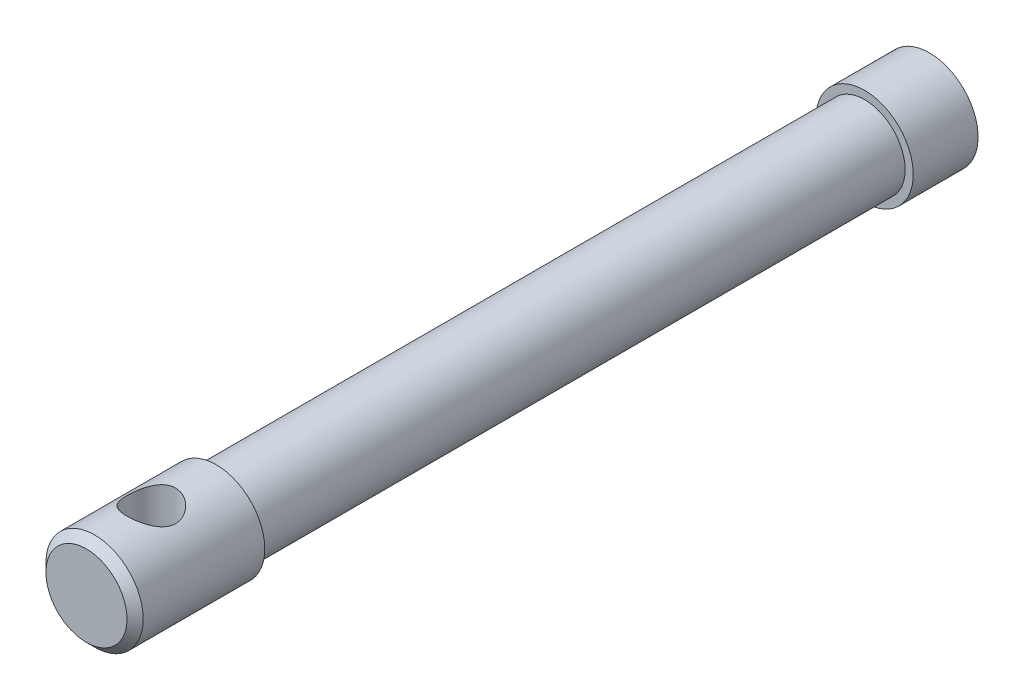
ISO-10303-21;
HEADER;
FILE_DESCRIPTION(('STEP AP214'),'2;1');
FILE_NAME('part.step','',(''),(''),'','','');
FILE_SCHEMA(('AUTOMOTIVE_DESIGN { 1 0 10303 214 1 1 1 1 }'));
ENDSEC;
DATA;
#1=APPLICATION_CONTEXT('core data for automotive mechanical design processes');
#2=APPLICATION_PROTOCOL_DEFINITION('international standard','automotive_design',2000,#1);
#3=PRODUCT_CONTEXT('',#1,'mechanical');
#4=PRODUCT('Part','Part','',(#3));
#5=PRODUCT_RELATED_PRODUCT_CATEGORY('part','',(#4));
#6=PRODUCT_DEFINITION_FORMATION('','',#4);
#7=PRODUCT_DEFINITION_CONTEXT('part definition',#1,'design');
#8=PRODUCT_DEFINITION('design','',#6,#7);
#9=PRODUCT_DEFINITION_SHAPE('','',#8);
#10=(LENGTH_UNIT() NAMED_UNIT(*) SI_UNIT(.MILLI.,.METRE.));
#11=(NAMED_UNIT(*) PLANE_ANGLE_UNIT() SI_UNIT($,.RADIAN.));
#12=(NAMED_UNIT(*) SI_UNIT($,.STERADIAN.) SOLID_ANGLE_UNIT());
#13=UNCERTAINTY_MEASURE_WITH_UNIT(LENGTH_MEASURE(1.E-05),#10,'distance_accuracy_value','');
#14=(GEOMETRIC_REPRESENTATION_CONTEXT(3) GLOBAL_UNCERTAINTY_ASSIGNED_CONTEXT((#13)) GLOBAL_UNIT_ASSIGNED_CONTEXT((#10,
#11,#12)) REPRESENTATION_CONTEXT('',''));
#15=CARTESIAN_POINT('',(0.,0.,0.));
#16=DIRECTION('',(0.,0.,1.));
#17=DIRECTION('',(1.,0.,0.));
#18=AXIS2_PLACEMENT_3D('',#15,#16,#17);
#19=CARTESIAN_POINT('',(0.,0.,-165.1));
#20=DIRECTION('',(0.,0.,1.));
#21=DIRECTION('',(1.,0.,0.));
#22=AXIS2_PLACEMENT_3D('',#19,#20,#21);
#23=CYLINDRICAL_SURFACE('',#22,7.9375);
#24=CARTESIAN_POINT('',(0.,0.,-25.4));
#25=DIRECTION('',(0.,0.,1.));
#26=DIRECTION('',(1.,0.,0.));
#27=AXIS2_PLACEMENT_3D('',#24,#25,#26);
#28=CIRCLE('',#27,7.9375);
#29=CARTESIAN_POINT('',(7.9375,0.,-25.4));
#30=VERTEX_POINT('',#29);
#31=EDGE_CURVE('E52',#30,#30,#28,.F.);
#32=ORIENTED_EDGE('',*,*,#31,.T.);
#33=EDGE_LOOP('',(#32));
#34=FACE_BOUND('',#33,.T.);
#35=CARTESIAN_POINT('',(0.,0.,-152.4));
#36=DIRECTION('',(0.,0.,-1.));
#37=DIRECTION('',(-1.,0.,0.));
#38=AXIS2_PLACEMENT_3D('',#35,#36,#37);
#39=CIRCLE('',#38,7.9375);
#40=CARTESIAN_POINT('',(-7.9375,0.,-152.4));
#41=VERTEX_POINT('',#40);
#42=EDGE_CURVE('E41',#41,#41,#39,.F.);
#43=ORIENTED_EDGE('',*,*,#42,.T.);
#44=EDGE_LOOP('',(#43));
#45=FACE_BOUND('',#44,.T.);
#46=ADVANCED_FACE('F37',(#34,#45),#23,.T.);
#47=CARTESIAN_POINT('',(0.,0.,-25.4));
#48=DIRECTION('',(0.,0.,1.));
#49=DIRECTION('',(1.,0.,0.));
#50=AXIS2_PLACEMENT_3D('',#47,#48,#49);
#51=CYLINDRICAL_SURFACE('',#50,9.525);
#52=CARTESIAN_POINT('',(0.,-9.525,-17.4625));
#53=CARTESIAN_POINT('',(-0.125243167799989,-9.5249996206372,-17.4624995883142));
#54=CARTESIAN_POINT('',(-0.250495089131835,-9.52252400598023,-17.4575538815409));
#55=CARTESIAN_POINT('',(-0.500076393496526,-9.51268396387997,-17.4378274933583));
#56=CARTESIAN_POINT('',(-0.624405351393146,-9.50531740964971,-17.4230425334198));
#57=CARTESIAN_POINT('',(-0.871331001268148,-9.48587193787975,-17.3837846575478));
#58=CARTESIAN_POINT('',(-0.993924963523298,-9.47378630044847,-17.359297925728));
#59=CARTESIAN_POINT('',(-1.23637011508467,-9.44520637539277,-17.3009077343834));
#60=CARTESIAN_POINT('',(-1.35622016139572,-9.42871028557932,-17.2670004252214));
#61=CARTESIAN_POINT('',(-1.59183120722171,-9.39179697222459,-17.1902959954649));
#62=CARTESIAN_POINT('',(-1.70760770137533,-9.37139708461428,-17.1475381122571));
#63=CARTESIAN_POINT('',(-1.93495086483045,-9.3271126718355,-17.0534500200897));
#64=CARTESIAN_POINT('',(-2.04651593025,-9.30322683559748,-17.0021165847989));
#65=CARTESIAN_POINT('',(-2.37384489745524,-9.22716144615755,-16.8359458534294));
#66=CARTESIAN_POINT('',(-2.58250225923313,-9.17053150857179,-16.7088526884547));
#67=CARTESIAN_POINT('',(-2.9885453858336,-9.04666081910159,-16.4170309696508));
#68=CARTESIAN_POINT('',(-3.18448556312959,-8.97898540114139,-16.2504907176509));
#69=CARTESIAN_POINT('',(-3.5469969745544,-8.84205954293001,-15.8884088932679));
#70=CARTESIAN_POINT('',(-3.71354582861883,-8.77280794740667,-15.6928454279268));
#71=CARTESIAN_POINT('',(-4.02553537328567,-8.63435408613187,-15.2598674226152));
#72=CARTESIAN_POINT('',(-4.16833749963762,-8.56557212539103,-15.0203834507436));
#73=CARTESIAN_POINT('',(-4.35029005345508,-8.47379640254792,-14.6431780616274));
#74=CARTESIAN_POINT('',(-4.40557901885787,-8.44509626519091,-14.514399825047));
#75=CARTESIAN_POINT('',(-4.50483773649694,-8.39256904955604,-14.2516213108777));
#76=CARTESIAN_POINT('',(-4.54881419057647,-8.36873908777994,-14.1176241795386));
#77=CARTESIAN_POINT('',(-4.62261399582858,-8.32818911059645,-13.8534843907029));
#78=CARTESIAN_POINT('',(-4.65312214328153,-8.31113119648639,-13.7235845780924));
#79=CARTESIAN_POINT('',(-4.7031837839128,-8.28290506375683,-13.4611183128582));
#80=CARTESIAN_POINT('',(-4.72274308921002,-8.27173372047612,-13.3285533138226));
#81=CARTESIAN_POINT('',(-4.75061653464239,-8.25575723957705,-13.0619427455447));
#82=CARTESIAN_POINT('',(-4.75893744712047,-8.25094826797976,-12.9278981170864));
#83=CARTESIAN_POINT('',(-4.76421854927812,-8.24790017307781,-12.659518180681));
#84=CARTESIAN_POINT('',(-4.76117982286953,-8.24966042295241,-12.5251829016895));
#85=CARTESIAN_POINT('',(-4.74483797280581,-8.25906842780931,-12.2735605369466));
#86=CARTESIAN_POINT('',(-4.73280973448218,-8.26598467895691,-12.1561612672688));
#87=CARTESIAN_POINT('',(-4.7001560114978,-8.28459407928507,-11.9229366742551));
#88=CARTESIAN_POINT('',(-4.67952782662532,-8.29628872876442,-11.8071118570707));
#89=CARTESIAN_POINT('',(-4.60506661909892,-8.33800444414718,-11.4632035948973));
#90=CARTESIAN_POINT('',(-4.5386452957775,-8.37466460391199,-11.2385132214148));
#91=CARTESIAN_POINT('',(-4.37297035741612,-8.46236620531704,-10.7986357725427));
#92=CARTESIAN_POINT('',(-4.27298801966147,-8.51372273880604,-10.5837919649744));
#93=CARTESIAN_POINT('',(-4.04355977442936,-8.62505005190895,-10.1728624960871));
#94=CARTESIAN_POINT('',(-3.91410063264099,-8.68502469635285,-9.97678531682722));
#95=CARTESIAN_POINT('',(-3.61029947812719,-8.8160120789406,-9.58284506896536));
#96=CARTESIAN_POINT('',(-3.43234782914613,-8.88746017331488,-9.38790797985575));
#97=CARTESIAN_POINT('',(-3.04584295330871,-9.02721381532401,-9.02935121852992));
#98=CARTESIAN_POINT('',(-2.83727518509305,-9.0955178493011,-8.86574651343943));
#99=CARTESIAN_POINT('',(-2.49965137796343,-9.19195370403877,-8.64383467336283));
#100=CARTESIAN_POINT('',(-2.38002127368373,-9.22372787983903,-8.57248202968255));
#101=CARTESIAN_POINT('',(-2.13427687141611,-9.28366556941997,-8.44022178631796));
#102=CARTESIAN_POINT('',(-2.00816533613017,-9.31183060399966,-8.37930978353973));
#103=CARTESIAN_POINT('',(-1.75034069526615,-9.36371844925579,-8.26859004451779));
#104=CARTESIAN_POINT('',(-1.61862987016266,-9.38744304755806,-8.21877783818485));
#105=CARTESIAN_POINT('',(-1.3505610663951,-9.42974072645533,-8.13083376217831));
#106=CARTESIAN_POINT('',(-1.21420362433566,-9.4483143996453,-8.09270054882684));
#107=CARTESIAN_POINT('',(-0.949450109300049,-9.47841891468132,-8.03128927908233));
#108=CARTESIAN_POINT('',(-0.821329961906903,-9.49040564136936,-8.00704248612877));
#109=CARTESIAN_POINT('',(-0.563164063018348,-9.50921741531494,-7.96911534118488));
#110=CARTESIAN_POINT('',(-0.43311848278076,-9.51604291885924,-7.95543405513057));
#111=CARTESIAN_POINT('',(-0.172222200636558,-9.52433687415141,-7.93882096304197));
#112=CARTESIAN_POINT('',(-0.0413718261918276,-9.52580737679104,-7.93588504167853));
#113=CARTESIAN_POINT('',(0.220072847166309,-9.52335444060485,-7.94079143418983));
#114=CARTESIAN_POINT('',(0.350667157156419,-9.51943124049279,-7.94863327106403));
#115=CARTESIAN_POINT('',(0.600383632816324,-9.50681651861088,-7.97396043682593));
#116=CARTESIAN_POINT('',(0.719607798059651,-9.49851975936574,-7.99064795465564));
#117=CARTESIAN_POINT('',(0.956123558476325,-9.47763434053446,-8.03291618607806));
#118=CARTESIAN_POINT('',(1.07341452918894,-9.46504432155854,-8.05849971649687));
#119=CARTESIAN_POINT('',(1.30523272581463,-9.43586934009923,-8.11828705590225));
#120=CARTESIAN_POINT('',(1.41976078572846,-9.41928560017321,-8.15248822700577));
#121=CARTESIAN_POINT('',(1.64542419391326,-9.382499981618,-8.22918232366048));
#122=CARTESIAN_POINT('',(1.75655822362735,-9.36229671724176,-8.27167842551346));
#123=CARTESIAN_POINT('',(2.09007412634844,-9.29566539786795,-8.4137002860248));
#124=CARTESIAN_POINT('',(2.3061103310862,-9.24405921515466,-8.52608855655025));
#125=CARTESIAN_POINT('',(2.7168591855057,-9.13180205397676,-8.78098846404179));
#126=CARTESIAN_POINT('',(2.91156269769227,-9.07114722574502,-8.92351293334768));
#127=CARTESIAN_POINT('',(3.29452731372962,-8.93960783885979,-9.25079489471238));
#128=CARTESIAN_POINT('',(3.48027815582498,-8.868303631423,-9.43832528614419));
#129=CARTESIAN_POINT('',(3.81886460963264,-8.72786114875584,-9.84218618662009));
#130=CARTESIAN_POINT('',(3.97167745144758,-8.65872439991558,-10.0585364526084));
#131=CARTESIAN_POINT('',(4.17638881115548,-8.56092960704944,-10.4068472643334));
#132=CARTESIAN_POINT('',(4.24173741059432,-8.52864647367417,-10.5300629580027));
#133=CARTESIAN_POINT('',(4.36167001930206,-8.46793790675362,-10.782516630992));
#134=CARTESIAN_POINT('',(4.41625890421415,-8.43951072775552,-10.9117518496581));
#135=CARTESIAN_POINT('',(4.51403084118841,-8.38762286815761,-11.1753113761473));
#136=CARTESIAN_POINT('',(4.55722321448887,-8.36415813189979,-11.3096314216019));
#137=CARTESIAN_POINT('',(4.63167416627274,-8.32316235190995,-11.5824232182906));
#138=CARTESIAN_POINT('',(4.66293459251873,-8.30563038948562,-11.7208943231132));
#139=CARTESIAN_POINT('',(4.71062527640278,-8.27866590076996,-11.9873061449123));
#140=CARTESIAN_POINT('',(4.72819092555356,-8.26861751501085,-12.1149820086718));
#141=CARTESIAN_POINT('',(4.75291664228841,-8.25443000373948,-12.3716591965268));
#142=CARTESIAN_POINT('',(4.76007780009145,-8.25029025909993,-12.5006603803239));
#143=CARTESIAN_POINT('',(4.7638856717754,-8.24809207938036,-12.7588234710669));
#144=CARTESIAN_POINT('',(4.76053608147038,-8.25003150672727,-12.8879853055593));
#145=CARTESIAN_POINT('',(4.74338307929259,-8.2599055190099,-13.1453752439453));
#146=CARTESIAN_POINT('',(4.72958009537705,-8.26783985851659,-13.2736033858471));
#147=CARTESIAN_POINT('',(4.69353669139923,-8.28834856879423,-13.5158735925565));
#148=CARTESIAN_POINT('',(4.67222934629288,-8.30040666790683,-13.6300996380418));
#149=CARTESIAN_POINT('',(4.62147643847892,-8.32877048505192,-13.8562027840155));
#150=CARTESIAN_POINT('',(4.59202835912458,-8.34507751652014,-13.9680791465907));
#151=CARTESIAN_POINT('',(4.49189766535446,-8.3996615585496,-14.299168552145));
#152=CARTESIAN_POINT('',(4.40940547807408,-8.44361545117001,-14.5139944304742));
#153=CARTESIAN_POINT('',(4.20916574352957,-8.54528603634261,-14.9413852260527));
#154=CARTESIAN_POINT('',(4.08942191082135,-8.60372898549138,-15.1528285423799));
#155=CARTESIAN_POINT('',(3.82024338512734,-8.72658246261697,-15.5540368143899));
#156=CARTESIAN_POINT('',(3.67079324521365,-8.79099608593484,-15.7437904104806));
#157=CARTESIAN_POINT('',(3.32520368388597,-8.92789150982252,-16.1201492351934));
#158=CARTESIAN_POINT('',(3.12559766366325,-9.00040265167881,-16.3035704078762));
#159=CARTESIAN_POINT('',(2.69626914168462,-9.13818513010387,-16.6350960361771));
#160=CARTESIAN_POINT('',(2.4665305095516,-9.20345255422175,-16.7831814555507));
#161=CARTESIAN_POINT('',(2.10268072495819,-9.29086610240478,-16.9754204698368));
#162=CARTESIAN_POINT('',(1.97763300723183,-9.31834760006229,-17.0347008931346));
#163=CARTESIAN_POINT('',(1.72211552262134,-9.36893044835914,-17.1423991887047));
#164=CARTESIAN_POINT('',(1.59164845695407,-9.39203394996841,-17.1908223974304));
#165=CARTESIAN_POINT('',(1.32654199767925,-9.43312646132604,-17.2761390300447));
#166=CARTESIAN_POINT('',(1.19191242135595,-9.45112661821364,-17.3130576010708));
#167=CARTESIAN_POINT('',(0.919388438520269,-9.48151473751691,-17.3750010604458));
#168=CARTESIAN_POINT('',(0.781496080561077,-9.49390612793916,-17.400033214082));
#169=CARTESIAN_POINT('',(0.536297175823774,-9.51048759454479,-17.4334244917289));
#170=CARTESIAN_POINT('',(0.42941158376785,-9.51592021375587,-17.4443184453916));
#171=CARTESIAN_POINT('',(0.215019489362878,-9.52317662911679,-17.4588564762833));
#172=CARTESIAN_POINT('',(0.107512969957934,-9.52500032565785,-17.462500353405));
#173=CARTESIAN_POINT('',(0.,-9.525,-17.4625));
#174=B_SPLINE_CURVE_WITH_KNOTS('',3,(#52,#53,#54,#55,#56,#57,#58,#59,#60,#61,#62,#63,#64,#65,
#66,#67,#68,#69,#70,#71,#72,#73,#74,#75,#76,#77,#78,#79,#80,#81,#82,#83,#84,#85,#86,#87,#88,#89,
#90,#91,#92,#93,#94,#95,#96,#97,#98,#99,#100,#101,#102,#103,#104,#105,#106,#107,#108,#109,#110,
#111,#112,#113,#114,#115,#116,#117,#118,#119,#120,#121,#122,#123,#124,#125,#126,#127,#128,#129,
#130,#131,#132,#133,#134,#135,#136,#137,#138,#139,#140,#141,#142,#143,#144,#145,#146,#147,#148,
#149,#150,#151,#152,#153,#154,#155,#156,#157,#158,#159,#160,#161,#162,#163,#164,#165,#166,#167,
#168,#169,#170,#171,#172,#173),.UNSPECIFIED.,.T.,.F.,(4,2,2,2,2,2,2,2,2,2,2,2,2,2,2,2,2,2,2,2,2,
2,2,2,2,2,2,2,2,2,2,2,2,2,2,2,2,2,2,2,2,2,2,2,2,2,2,2,2,2,2,2,2,2,2,2,2,2,2,2,4),(0.,
0.37562341815402,0.751410280296022,1.12773421934005,1.50421216665562,1.87905550525341,
2.25404018794787,3.00318908218551,3.7976597983107,4.59273287924314,5.44946389368039,
5.8781190538996,6.30651967909288,6.70950847539314,7.11228314445236,7.51481498990845,
7.91730842763879,8.27152461989833,8.62585211283934,9.33399259637595,10.0586277474397,
10.7835888844336,11.6004728904415,12.4177461446779,12.8458801890468,13.2738332313566,
13.701613616489,14.1293447666274,14.521651524315,14.913923595397,15.3060454158579,
15.698149882404,16.0597456619957,16.4214560413944,16.7830558344936,17.144794364286,
17.8882174899416,18.6319578135026,19.4487341785404,20.2660733794108,20.6950689367829,
21.1238696504806,21.5523185520335,21.9807010777177,22.3679690015927,22.7551963432537,
23.1422875423821,23.5293628950278,23.8794231642634,24.2295917732494,24.9294696536928,
25.6763690993088,26.423657944613,27.2617475314397,28.1002876036314,28.5230685284024,
28.9456411934233,29.3672836019069,29.7886679587935,30.1111069020891,30.4335547448008),.UNSPECIFIED.);
#175=CARTESIAN_POINT('',(0.,-9.525,-17.4625));
#176=VERTEX_POINT('',#175);
#177=EDGE_CURVE('E56',#176,#176,#174,.T.);
#178=ORIENTED_EDGE('',*,*,#177,.T.);
#179=EDGE_LOOP('',(#178));
#180=FACE_BOUND('',#179,.T.);
#181=CARTESIAN_POINT('',(0.,0.,-1.58749999999999));
#182=DIRECTION('',(0.,0.,1.));
#183=DIRECTION('',(1.,0.,0.));
#184=AXIS2_PLACEMENT_3D('',#181,#182,#183);
#185=CIRCLE('',#184,9.525);
#186=CARTESIAN_POINT('',(9.525,0.,-1.58749999999999));
#187=VERTEX_POINT('',#186);
#188=EDGE_CURVE('E10',#187,#187,#185,.F.);
#189=ORIENTED_EDGE('',*,*,#188,.T.);
#190=EDGE_LOOP('',(#189));
#191=FACE_BOUND('',#190,.T.);
#192=CARTESIAN_POINT('',(0.,0.,-25.4));
#193=DIRECTION('',(0.,0.,1.));
#194=DIRECTION('',(1.,0.,0.));
#195=AXIS2_PLACEMENT_3D('',#192,#193,#194);
#196=CIRCLE('',#195,9.525);
#197=CARTESIAN_POINT('',(9.525,0.,-25.4));
#198=VERTEX_POINT('',#197);
#199=EDGE_CURVE('E118',#198,#198,#196,.T.);
#200=ORIENTED_EDGE('',*,*,#199,.T.);
#201=EDGE_LOOP('',(#200));
#202=FACE_BOUND('',#201,.T.);
#203=CARTESIAN_POINT('',(0.,9.525,-17.4625));
#204=CARTESIAN_POINT('',(0.125243167799989,9.5249996206372,-17.4624995883142));
#205=CARTESIAN_POINT('',(0.250495089131835,9.52252400598023,-17.4575538815409));
#206=CARTESIAN_POINT('',(0.500076393496526,9.51268396387997,-17.4378274933583));
#207=CARTESIAN_POINT('',(0.624405351393146,9.50531740964971,-17.4230425334198));
#208=CARTESIAN_POINT('',(0.871331001268148,9.48587193787975,-17.3837846575478));
#209=CARTESIAN_POINT('',(0.993924963523298,9.47378630044847,-17.359297925728));
#210=CARTESIAN_POINT('',(1.23637011508467,9.44520637539277,-17.3009077343834));
#211=CARTESIAN_POINT('',(1.35622016139572,9.42871028557932,-17.2670004252214));
#212=CARTESIAN_POINT('',(1.59183120722171,9.39179697222459,-17.1902959954649));
#213=CARTESIAN_POINT('',(1.70760770137533,9.37139708461428,-17.1475381122571));
#214=CARTESIAN_POINT('',(1.93495086483045,9.3271126718355,-17.0534500200897));
#215=CARTESIAN_POINT('',(2.04651593025,9.30322683559748,-17.0021165847989));
#216=CARTESIAN_POINT('',(2.37384489745524,9.22716144615755,-16.8359458534294));
#217=CARTESIAN_POINT('',(2.58250225923313,9.17053150857179,-16.7088526884547));
#218=CARTESIAN_POINT('',(2.9885453858336,9.04666081910159,-16.4170309696508));
#219=CARTESIAN_POINT('',(3.18448556312959,8.97898540114139,-16.2504907176509));
#220=CARTESIAN_POINT('',(3.5469969745544,8.84205954293001,-15.8884088932679));
#221=CARTESIAN_POINT('',(3.71354582861883,8.77280794740667,-15.6928454279268));
#222=CARTESIAN_POINT('',(4.02553537328567,8.63435408613187,-15.2598674226152));
#223=CARTESIAN_POINT('',(4.16833749963762,8.56557212539103,-15.0203834507436));
#224=CARTESIAN_POINT('',(4.35029005345508,8.47379640254792,-14.6431780616274));
#225=CARTESIAN_POINT('',(4.40557901885787,8.44509626519091,-14.514399825047));
#226=CARTESIAN_POINT('',(4.50483773649694,8.39256904955604,-14.2516213108777));
#227=CARTESIAN_POINT('',(4.54881419057647,8.36873908777994,-14.1176241795386));
#228=CARTESIAN_POINT('',(4.62261399582858,8.32818911059645,-13.8534843907029));
#229=CARTESIAN_POINT('',(4.65312214328153,8.31113119648639,-13.7235845780924));
#230=CARTESIAN_POINT('',(4.7031837839128,8.28290506375683,-13.4611183128582));
#231=CARTESIAN_POINT('',(4.72274308921002,8.27173372047612,-13.3285533138226));
#232=CARTESIAN_POINT('',(4.75061653464239,8.25575723957705,-13.0619427455447));
#233=CARTESIAN_POINT('',(4.75893744712047,8.25094826797976,-12.9278981170864));
#234=CARTESIAN_POINT('',(4.76421854927812,8.24790017307781,-12.659518180681));
#235=CARTESIAN_POINT('',(4.76117982286953,8.24966042295241,-12.5251829016895));
#236=CARTESIAN_POINT('',(4.74483797280581,8.25906842780931,-12.2735605369466));
#237=CARTESIAN_POINT('',(4.73280973448218,8.26598467895691,-12.1561612672688));
#238=CARTESIAN_POINT('',(4.7001560114978,8.28459407928507,-11.9229366742551));
#239=CARTESIAN_POINT('',(4.67952782662532,8.29628872876442,-11.8071118570707));
#240=CARTESIAN_POINT('',(4.60506661909892,8.33800444414718,-11.4632035948973));
#241=CARTESIAN_POINT('',(4.5386452957775,8.37466460391199,-11.2385132214148));
#242=CARTESIAN_POINT('',(4.37297035741612,8.46236620531704,-10.7986357725427));
#243=CARTESIAN_POINT('',(4.27298801966147,8.51372273880604,-10.5837919649744));
#244=CARTESIAN_POINT('',(4.04355977442936,8.62505005190895,-10.1728624960871));
#245=CARTESIAN_POINT('',(3.91410063264099,8.68502469635285,-9.97678531682722));
#246=CARTESIAN_POINT('',(3.61029947812719,8.8160120789406,-9.58284506896536));
#247=CARTESIAN_POINT('',(3.43234782914613,8.88746017331488,-9.38790797985575));
#248=CARTESIAN_POINT('',(3.04584295330871,9.02721381532401,-9.02935121852992));
#249=CARTESIAN_POINT('',(2.83727518509305,9.0955178493011,-8.86574651343943));
#250=CARTESIAN_POINT('',(2.49965137796343,9.19195370403877,-8.64383467336283));
#251=CARTESIAN_POINT('',(2.38002127368373,9.22372787983903,-8.57248202968255));
#252=CARTESIAN_POINT('',(2.13427687141611,9.28366556941997,-8.44022178631796));
#253=CARTESIAN_POINT('',(2.00816533613017,9.31183060399966,-8.37930978353973));
#254=CARTESIAN_POINT('',(1.75034069526615,9.36371844925579,-8.26859004451779));
#255=CARTESIAN_POINT('',(1.61862987016266,9.38744304755806,-8.21877783818485));
#256=CARTESIAN_POINT('',(1.3505610663951,9.42974072645533,-8.13083376217831));
#257=CARTESIAN_POINT('',(1.21420362433566,9.4483143996453,-8.09270054882684));
#258=CARTESIAN_POINT('',(0.949450109300049,9.47841891468132,-8.03128927908233));
#259=CARTESIAN_POINT('',(0.821329961906903,9.49040564136936,-8.00704248612877));
#260=CARTESIAN_POINT('',(0.563164063018348,9.50921741531494,-7.96911534118488));
#261=CARTESIAN_POINT('',(0.43311848278076,9.51604291885924,-7.95543405513057));
#262=CARTESIAN_POINT('',(0.172222200636558,9.52433687415141,-7.93882096304197));
#263=CARTESIAN_POINT('',(0.0413718261918276,9.52580737679104,-7.93588504167853));
#264=CARTESIAN_POINT('',(-0.220072847166309,9.52335444060485,-7.94079143418983));
#265=CARTESIAN_POINT('',(-0.350667157156419,9.51943124049279,-7.94863327106403));
#266=CARTESIAN_POINT('',(-0.600383632816324,9.50681651861088,-7.97396043682593));
#267=CARTESIAN_POINT('',(-0.719607798059651,9.49851975936574,-7.99064795465564));
#268=CARTESIAN_POINT('',(-0.956123558476325,9.47763434053446,-8.03291618607806));
#269=CARTESIAN_POINT('',(-1.07341452918894,9.46504432155854,-8.05849971649687));
#270=CARTESIAN_POINT('',(-1.30523272581463,9.43586934009923,-8.11828705590225));
#271=CARTESIAN_POINT('',(-1.41976078572846,9.41928560017321,-8.15248822700577));
#272=CARTESIAN_POINT('',(-1.64542419391326,9.382499981618,-8.22918232366048));
#273=CARTESIAN_POINT('',(-1.75655822362735,9.36229671724176,-8.27167842551346));
#274=CARTESIAN_POINT('',(-2.09007412634844,9.29566539786795,-8.4137002860248));
#275=CARTESIAN_POINT('',(-2.3061103310862,9.24405921515466,-8.52608855655025));
#276=CARTESIAN_POINT('',(-2.7168591855057,9.13180205397676,-8.78098846404179));
#277=CARTESIAN_POINT('',(-2.91156269769227,9.07114722574502,-8.92351293334768));
#278=CARTESIAN_POINT('',(-3.29452731372962,8.93960783885979,-9.25079489471238));
#279=CARTESIAN_POINT('',(-3.48027815582498,8.868303631423,-9.43832528614419));
#280=CARTESIAN_POINT('',(-3.81886460963264,8.72786114875584,-9.84218618662009));
#281=CARTESIAN_POINT('',(-3.97167745144758,8.65872439991558,-10.0585364526084));
#282=CARTESIAN_POINT('',(-4.17638881115548,8.56092960704944,-10.4068472643334));
#283=CARTESIAN_POINT('',(-4.24173741059432,8.52864647367417,-10.5300629580027));
#284=CARTESIAN_POINT('',(-4.36167001930206,8.46793790675362,-10.782516630992));
#285=CARTESIAN_POINT('',(-4.41625890421415,8.43951072775552,-10.9117518496581));
#286=CARTESIAN_POINT('',(-4.51403084118841,8.38762286815761,-11.1753113761473));
#287=CARTESIAN_POINT('',(-4.55722321448887,8.36415813189979,-11.3096314216019));
#288=CARTESIAN_POINT('',(-4.63167416627274,8.32316235190995,-11.5824232182906));
#289=CARTESIAN_POINT('',(-4.66293459251873,8.30563038948562,-11.7208943231132));
#290=CARTESIAN_POINT('',(-4.71062527640278,8.27866590076996,-11.9873061449123));
#291=CARTESIAN_POINT('',(-4.72819092555356,8.26861751501085,-12.1149820086718));
#292=CARTESIAN_POINT('',(-4.75291664228841,8.25443000373948,-12.3716591965268));
#293=CARTESIAN_POINT('',(-4.76007780009145,8.25029025909993,-12.5006603803239));
#294=CARTESIAN_POINT('',(-4.7638856717754,8.24809207938036,-12.7588234710669));
#295=CARTESIAN_POINT('',(-4.76053608147038,8.25003150672727,-12.8879853055593));
#296=CARTESIAN_POINT('',(-4.74338307929259,8.2599055190099,-13.1453752439453));
#297=CARTESIAN_POINT('',(-4.72958009537705,8.26783985851659,-13.2736033858471));
#298=CARTESIAN_POINT('',(-4.69353669139923,8.28834856879423,-13.5158735925565));
#299=CARTESIAN_POINT('',(-4.67222934629288,8.30040666790683,-13.6300996380418));
#300=CARTESIAN_POINT('',(-4.62147643847892,8.32877048505192,-13.8562027840155));
#301=CARTESIAN_POINT('',(-4.59202835912458,8.34507751652014,-13.9680791465907));
#302=CARTESIAN_POINT('',(-4.49189766535446,8.3996615585496,-14.299168552145));
#303=CARTESIAN_POINT('',(-4.40940547807408,8.44361545117001,-14.5139944304742));
#304=CARTESIAN_POINT('',(-4.20916574352957,8.54528603634261,-14.9413852260527));
#305=CARTESIAN_POINT('',(-4.08942191082135,8.60372898549138,-15.1528285423799));
#306=CARTESIAN_POINT('',(-3.82024338512734,8.72658246261697,-15.5540368143899));
#307=CARTESIAN_POINT('',(-3.67079324521365,8.79099608593484,-15.7437904104806));
#308=CARTESIAN_POINT('',(-3.32520368388597,8.92789150982252,-16.1201492351934));
#309=CARTESIAN_POINT('',(-3.12559766366325,9.00040265167881,-16.3035704078762));
#310=CARTESIAN_POINT('',(-2.69626914168462,9.13818513010387,-16.6350960361771));
#311=CARTESIAN_POINT('',(-2.4665305095516,9.20345255422175,-16.7831814555507));
#312=CARTESIAN_POINT('',(-2.10268072495819,9.29086610240478,-16.9754204698368));
#313=CARTESIAN_POINT('',(-1.97763300723183,9.31834760006229,-17.0347008931346));
#314=CARTESIAN_POINT('',(-1.72211552262134,9.36893044835914,-17.1423991887047));
#315=CARTESIAN_POINT('',(-1.59164845695407,9.39203394996841,-17.1908223974304));
#316=CARTESIAN_POINT('',(-1.32654199767925,9.43312646132604,-17.2761390300447));
#317=CARTESIAN_POINT('',(-1.19191242135595,9.45112661821364,-17.3130576010708));
#318=CARTESIAN_POINT('',(-0.919388438520269,9.48151473751691,-17.3750010604458));
#319=CARTESIAN_POINT('',(-0.781496080561077,9.49390612793916,-17.400033214082));
#320=CARTESIAN_POINT('',(-0.536297175823774,9.51048759454479,-17.4334244917289));
#321=CARTESIAN_POINT('',(-0.42941158376785,9.51592021375587,-17.4443184453916));
#322=CARTESIAN_POINT('',(-0.215019489362878,9.52317662911679,-17.4588564762833));
#323=CARTESIAN_POINT('',(-0.107512969957934,9.52500032565785,-17.462500353405));
#324=CARTESIAN_POINT('',(0.,9.525,-17.4625));
#325=B_SPLINE_CURVE_WITH_KNOTS('',3,(#203,#204,#205,#206,#207,#208,#209,#210,#211,#212,#213,
#214,#215,#216,#217,#218,#219,#220,#221,#222,#223,#224,#225,#226,#227,#228,#229,#230,#231,#232,
#233,#234,#235,#236,#237,#238,#239,#240,#241,#242,#243,#244,#245,#246,#247,#248,#249,#250,#251,
#252,#253,#254,#255,#256,#257,#258,#259,#260,#261,#262,#263,#264,#265,#266,#267,#268,#269,#270,
#271,#272,#273,#274,#275,#276,#277,#278,#279,#280,#281,#282,#283,#284,#285,#286,#287,#288,#289,
#290,#291,#292,#293,#294,#295,#296,#297,#298,#299,#300,#301,#302,#303,#304,#305,#306,#307,#308,
#309,#310,#311,#312,#313,#314,#315,#316,#317,#318,#319,#320,#321,#322,#323,#324),.UNSPECIFIED.,
.T.,.F.,(4,2,2,2,2,2,2,2,2,2,2,2,2,2,2,2,2,2,2,2,2,2,2,2,2,2,2,2,2,2,2,2,2,2,2,2,2,2,2,2,2,2,2,
2,2,2,2,2,2,2,2,2,2,2,2,2,2,2,2,2,4),(0.,0.37562341815402,0.751410280296022,1.12773421934005,
1.50421216665562,1.87905550525341,2.25404018794787,3.00318908218551,3.7976597983107,
4.59273287924314,5.44946389368039,5.8781190538996,6.30651967909288,6.70950847539314,
7.11228314445236,7.51481498990845,7.91730842763879,8.27152461989833,8.62585211283934,
9.33399259637595,10.0586277474397,10.7835888844336,11.6004728904415,12.4177461446779,
12.8458801890468,13.2738332313566,13.701613616489,14.1293447666274,14.521651524315,
14.913923595397,15.3060454158579,15.698149882404,16.0597456619957,16.4214560413944,
16.7830558344936,17.144794364286,17.8882174899416,18.6319578135026,19.4487341785404,
20.2660733794108,20.6950689367829,21.1238696504806,21.5523185520335,21.9807010777177,
22.3679690015927,22.7551963432537,23.1422875423821,23.5293628950278,23.8794231642634,
24.2295917732494,24.9294696536928,25.6763690993088,26.423657944613,27.2617475314397,
28.1002876036314,28.5230685284024,28.9456411934233,29.3672836019069,29.7886679587935,
30.1111069020891,30.4335547448008),.UNSPECIFIED.);
#326=CARTESIAN_POINT('',(0.,9.525,-17.4625));
#327=VERTEX_POINT('',#326);
#328=EDGE_CURVE('E64',#327,#327,#325,.T.);
#329=ORIENTED_EDGE('',*,*,#328,.T.);
#330=EDGE_LOOP('',(#329));
#331=FACE_BOUND('',#330,.T.);
#332=ADVANCED_FACE('F68',(#180,#191,#202,#331),#51,.T.);
#333=CARTESIAN_POINT('',(0.,0.,-25.4));
#334=DIRECTION('',(0.,0.,1.));
#335=DIRECTION('',(1.,0.,0.));
#336=AXIS2_PLACEMENT_3D('',#333,#334,#335);
#337=PLANE('',#336);
#338=ORIENTED_EDGE('',*,*,#31,.F.);
#339=EDGE_LOOP('',(#338));
#340=FACE_BOUND('',#339,.T.);
#341=ORIENTED_EDGE('',*,*,#199,.F.);
#342=EDGE_LOOP('',(#341));
#343=FACE_BOUND('',#342,.T.);
#344=ADVANCED_FACE('F79',(#340,#343),#337,.F.);
#345=CARTESIAN_POINT('',(0.,0.,0.));
#346=DIRECTION('',(0.,0.,1.));
#347=DIRECTION('',(1.,0.,0.));
#348=AXIS2_PLACEMENT_3D('',#345,#346,#347);
#349=PLANE('',#348);
#350=CARTESIAN_POINT('',(0.,0.,0.));
#351=DIRECTION('',(0.,0.,1.));
#352=DIRECTION('',(1.,0.,0.));
#353=AXIS2_PLACEMENT_3D('',#350,#351,#352);
#354=CIRCLE('',#353,7.93750000000001);
#355=CARTESIAN_POINT('',(7.93750000000001,0.,0.));
#356=VERTEX_POINT('',#355);
#357=EDGE_CURVE('E46',#356,#356,#354,.T.);
#358=ORIENTED_EDGE('',*,*,#357,.T.);
#359=EDGE_LOOP('',(#358));
#360=FACE_BOUND('',#359,.T.);
#361=ADVANCED_FACE('F82',(#360),#349,.T.);
#362=CARTESIAN_POINT('',(0.,0.,0.));
#363=DIRECTION('',(0.,0.,-1.));
#364=DIRECTION('',(-1.,0.,0.));
#365=AXIS2_PLACEMENT_3D('',#362,#363,#364);
#366=CONICAL_SURFACE('',#365,7.93750000000001,0.785398163397447);
#367=ORIENTED_EDGE('',*,*,#188,.F.);
#368=EDGE_LOOP('',(#367));
#369=FACE_BOUND('',#368,.T.);
#370=ORIENTED_EDGE('',*,*,#357,.F.);
#371=EDGE_LOOP('',(#370));
#372=FACE_BOUND('',#371,.T.);
#373=ADVANCED_FACE('F39',(#369,#372),#366,.T.);
#374=CARTESIAN_POINT('',(0.,39.878,-12.7));
#375=DIRECTION('',(0.,-1.,0.));
#376=DIRECTION('',(0.,0.,-1.));
#377=AXIS2_PLACEMENT_3D('',#374,#375,#376);
#378=CYLINDRICAL_SURFACE('',#377,4.7625);
#379=ORIENTED_EDGE('',*,*,#328,.F.);
#380=EDGE_LOOP('',(#379));
#381=FACE_BOUND('',#380,.T.);
#382=ORIENTED_EDGE('',*,*,#177,.F.);
#383=EDGE_LOOP('',(#382));
#384=FACE_BOUND('',#383,.T.);
#385=ADVANCED_FACE('F72',(#381,#384),#378,.F.);
#386=CARTESIAN_POINT('',(0.,0.,-152.4));
#387=DIRECTION('',(0.,0.,-1.));
#388=DIRECTION('',(-1.,0.,0.));
#389=AXIS2_PLACEMENT_3D('',#386,#387,#388);
#390=CYLINDRICAL_SURFACE('',#389,9.525);
#391=CARTESIAN_POINT('',(0.,0.,-152.4));
#392=DIRECTION('',(0.,0.,-1.));
#393=DIRECTION('',(-1.,0.,0.));
#394=AXIS2_PLACEMENT_3D('',#391,#392,#393);
#395=CIRCLE('',#394,9.525);
#396=CARTESIAN_POINT('',(-9.525,0.,-152.4));
#397=VERTEX_POINT('',#396);
#398=EDGE_CURVE('E112',#397,#397,#395,.T.);
#399=ORIENTED_EDGE('',*,*,#398,.T.);
#400=EDGE_LOOP('',(#399));
#401=FACE_BOUND('',#400,.T.);
#402=CARTESIAN_POINT('',(0.,0.,-165.1));
#403=DIRECTION('',(0.,0.,-1.));
#404=DIRECTION('',(-1.,0.,0.));
#405=AXIS2_PLACEMENT_3D('',#402,#403,#404);
#406=CIRCLE('',#405,9.525);
#407=CARTESIAN_POINT('',(-9.525,0.,-165.1));
#408=VERTEX_POINT('',#407);
#409=EDGE_CURVE('E109',#408,#408,#406,.T.);
#410=ORIENTED_EDGE('',*,*,#409,.F.);
#411=EDGE_LOOP('',(#410));
#412=FACE_BOUND('',#411,.T.);
#413=ADVANCED_FACE('F76',(#401,#412),#390,.T.);
#414=CARTESIAN_POINT('',(0.,0.,-152.4));
#415=DIRECTION('',(0.,0.,-1.));
#416=DIRECTION('',(-1.,0.,0.));
#417=AXIS2_PLACEMENT_3D('',#414,#415,#416);
#418=PLANE('',#417);
#419=ORIENTED_EDGE('',*,*,#42,.F.);
#420=EDGE_LOOP('',(#419));
#421=FACE_BOUND('',#420,.T.);
#422=ORIENTED_EDGE('',*,*,#398,.F.);
#423=EDGE_LOOP('',(#422));
#424=FACE_BOUND('',#423,.T.);
#425=ADVANCED_FACE('F101',(#421,#424),#418,.F.);
#426=CARTESIAN_POINT('',(0.,0.,-165.1));
#427=DIRECTION('',(0.,0.,1.));
#428=DIRECTION('',(1.,0.,0.));
#429=AXIS2_PLACEMENT_3D('',#426,#427,#428);
#430=PLANE('',#429);
#431=ORIENTED_EDGE('',*,*,#409,.T.);
#432=EDGE_LOOP('',(#431));
#433=FACE_BOUND('',#432,.T.);
#434=ADVANCED_FACE('F99',(#433),#430,.F.);
#435=CLOSED_SHELL('',(#46,#332,#344,#361,#373,#385,#413,#425,#434));
#436=MANIFOLD_SOLID_BREP('B2',#435);
#437=ADVANCED_BREP_SHAPE_REPRESENTATION('',(#18,#436),#14);
#438=SHAPE_DEFINITION_REPRESENTATION(#9,#437);
ENDSEC;
END-ISO-10303-21;
